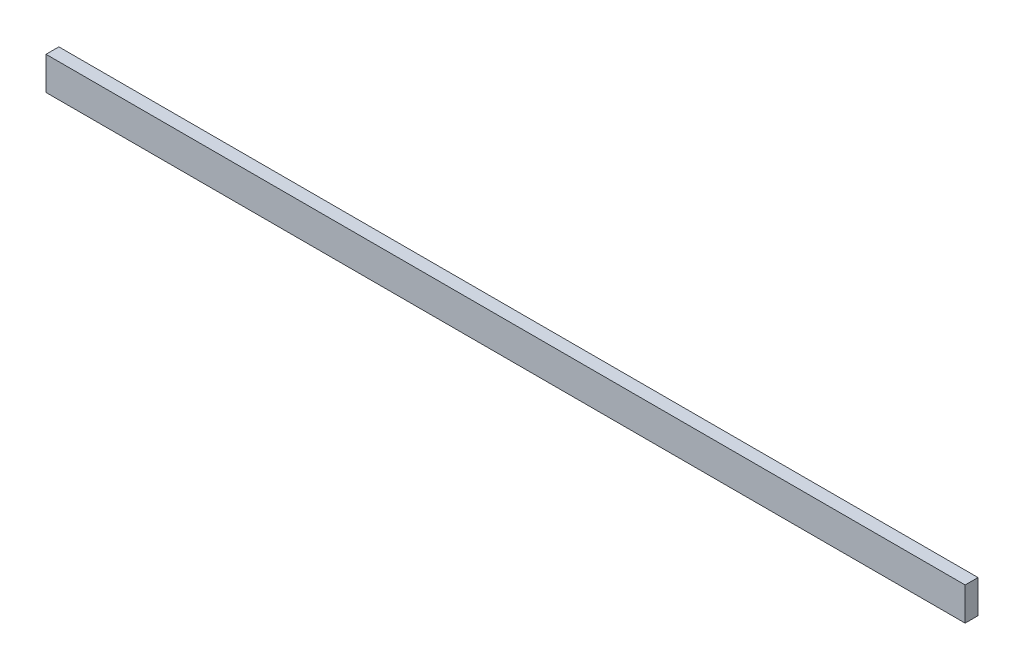
ISO-10303-21;
HEADER;
FILE_DESCRIPTION(('STEP AP214'),'2;1');
FILE_NAME('part.step','',(''),(''),'','','');
FILE_SCHEMA(('AUTOMOTIVE_DESIGN { 1 0 10303 214 1 1 1 1 }'));
ENDSEC;
DATA;
#1=APPLICATION_CONTEXT('core data for automotive mechanical design processes');
#2=APPLICATION_PROTOCOL_DEFINITION('international standard','automotive_design',2000,#1);
#3=PRODUCT_CONTEXT('',#1,'mechanical');
#4=PRODUCT('Part','Part','',(#3));
#5=PRODUCT_RELATED_PRODUCT_CATEGORY('part','',(#4));
#6=PRODUCT_DEFINITION_FORMATION('','',#4);
#7=PRODUCT_DEFINITION_CONTEXT('part definition',#1,'design');
#8=PRODUCT_DEFINITION('design','',#6,#7);
#9=PRODUCT_DEFINITION_SHAPE('','',#8);
#10=(LENGTH_UNIT() NAMED_UNIT(*) SI_UNIT(.MILLI.,.METRE.));
#11=(NAMED_UNIT(*) PLANE_ANGLE_UNIT() SI_UNIT($,.RADIAN.));
#12=(NAMED_UNIT(*) SI_UNIT($,.STERADIAN.) SOLID_ANGLE_UNIT());
#13=UNCERTAINTY_MEASURE_WITH_UNIT(LENGTH_MEASURE(1.E-05),#10,'distance_accuracy_value','');
#14=(GEOMETRIC_REPRESENTATION_CONTEXT(3) GLOBAL_UNCERTAINTY_ASSIGNED_CONTEXT((#13)) GLOBAL_UNIT_ASSIGNED_CONTEXT((#10,
#11,#12)) REPRESENTATION_CONTEXT('',''));
#15=CARTESIAN_POINT('',(0.,0.,0.));
#16=DIRECTION('',(0.,0.,1.));
#17=DIRECTION('',(1.,0.,0.));
#18=AXIS2_PLACEMENT_3D('',#15,#16,#17);
#19=CARTESIAN_POINT('',(-38.9216106508221,24.4845219883618,8.89));
#20=DIRECTION('',(1.,0.,0.));
#21=DIRECTION('',(0.,1.,0.));
#22=AXIS2_PLACEMENT_3D('',#19,#20,#21);
#23=PLANE('',#22);
#24=DIRECTION('',(0.,-1.,0.));
#25=VECTOR('',#24,1.);
#26=CARTESIAN_POINT('',(-38.9216106508221,24.4845219883618,0.));
#27=LINE('',#26,#25);
#28=CARTESIAN_POINT('',(-38.9216106508221,24.4845219883618,0.));
#29=VERTEX_POINT('',#28);
#30=CARTESIAN_POINT('',(-38.9216106508221,1.62452198836178,0.));
#31=VERTEX_POINT('',#30);
#32=EDGE_CURVE('E111',#29,#31,#27,.T.);
#33=ORIENTED_EDGE('',*,*,#32,.T.);
#34=DIRECTION('',(0.,0.,-1.));
#35=VECTOR('',#34,1.);
#36=CARTESIAN_POINT('',(-38.9216106508221,1.62452198836178,8.89));
#37=LINE('',#36,#35);
#38=CARTESIAN_POINT('',(-38.9216106508221,1.62452198836178,8.89));
#39=VERTEX_POINT('',#38);
#40=EDGE_CURVE('E11',#39,#31,#37,.T.);
#41=ORIENTED_EDGE('',*,*,#40,.F.);
#42=DIRECTION('',(0.,-1.,0.));
#43=VECTOR('',#42,1.);
#44=CARTESIAN_POINT('',(-38.9216106508221,24.4845219883618,8.89));
#45=LINE('',#44,#43);
#46=CARTESIAN_POINT('',(-38.9216106508221,24.4845219883618,8.89));
#47=VERTEX_POINT('',#46);
#48=EDGE_CURVE('E95',#47,#39,#45,.T.);
#49=ORIENTED_EDGE('',*,*,#48,.F.);
#50=DIRECTION('',(0.,0.,-1.));
#51=VECTOR('',#50,1.);
#52=CARTESIAN_POINT('',(-38.9216106508221,24.4845219883618,8.89));
#53=LINE('',#52,#51);
#54=EDGE_CURVE('E107',#47,#29,#53,.T.);
#55=ORIENTED_EDGE('',*,*,#54,.T.);
#56=EDGE_LOOP('',(#33,#41,#49,#55));
#57=FACE_BOUND('',#56,.T.);
#58=ADVANCED_FACE('F43',(#57),#23,.F.);
#59=CARTESIAN_POINT('',(-38.9216106508221,1.62452198836178,8.89));
#60=DIRECTION('',(0.,1.,0.));
#61=DIRECTION('',(0.,0.,1.));
#62=AXIS2_PLACEMENT_3D('',#59,#60,#61);
#63=PLANE('',#62);
#64=DIRECTION('',(1.,0.,0.));
#65=VECTOR('',#64,1.);
#66=CARTESIAN_POINT('',(-38.9216106508221,1.62452198836178,0.));
#67=LINE('',#66,#65);
#68=CARTESIAN_POINT('',(596.078389349178,1.62452198836178,0.));
#69=VERTEX_POINT('',#68);
#70=EDGE_CURVE('E100',#31,#69,#67,.T.);
#71=ORIENTED_EDGE('',*,*,#70,.T.);
#72=DIRECTION('',(0.,0.,-1.));
#73=VECTOR('',#72,1.);
#74=CARTESIAN_POINT('',(596.078389349178,1.62452198836178,8.89));
#75=LINE('',#74,#73);
#76=CARTESIAN_POINT('',(596.078389349178,1.62452198836178,8.89));
#77=VERTEX_POINT('',#76);
#78=EDGE_CURVE('E52',#77,#69,#75,.T.);
#79=ORIENTED_EDGE('',*,*,#78,.F.);
#80=DIRECTION('',(1.,0.,0.));
#81=VECTOR('',#80,1.);
#82=CARTESIAN_POINT('',(-38.9216106508221,1.62452198836178,8.89));
#83=LINE('',#82,#81);
#84=EDGE_CURVE('E90',#39,#77,#83,.T.);
#85=ORIENTED_EDGE('',*,*,#84,.F.);
#86=ORIENTED_EDGE('',*,*,#40,.T.);
#87=EDGE_LOOP('',(#71,#79,#85,#86));
#88=FACE_BOUND('',#87,.T.);
#89=ADVANCED_FACE('F99',(#88),#63,.F.);
#90=CARTESIAN_POINT('',(596.078389349178,24.4845219883618,8.89));
#91=DIRECTION('',(-1.,0.,0.));
#92=DIRECTION('',(0.,0.,1.));
#93=AXIS2_PLACEMENT_3D('',#90,#91,#92);
#94=PLANE('',#93);
#95=DIRECTION('',(0.,1.,0.));
#96=VECTOR('',#95,1.);
#97=CARTESIAN_POINT('',(596.078389349178,24.4845219883618,0.));
#98=LINE('',#97,#96);
#99=CARTESIAN_POINT('',(596.078389349178,24.4845219883618,0.));
#100=VERTEX_POINT('',#99);
#101=EDGE_CURVE('E77',#69,#100,#98,.T.);
#102=ORIENTED_EDGE('',*,*,#101,.T.);
#103=DIRECTION('',(0.,0.,-1.));
#104=VECTOR('',#103,1.);
#105=CARTESIAN_POINT('',(596.078389349178,24.4845219883618,8.89));
#106=LINE('',#105,#104);
#107=CARTESIAN_POINT('',(596.078389349178,24.4845219883618,8.89));
#108=VERTEX_POINT('',#107);
#109=EDGE_CURVE('E102',#108,#100,#106,.T.);
#110=ORIENTED_EDGE('',*,*,#109,.F.);
#111=DIRECTION('',(0.,1.,0.));
#112=VECTOR('',#111,1.);
#113=CARTESIAN_POINT('',(596.078389349178,24.4845219883618,8.89));
#114=LINE('',#113,#112);
#115=EDGE_CURVE('E93',#77,#108,#114,.T.);
#116=ORIENTED_EDGE('',*,*,#115,.F.);
#117=ORIENTED_EDGE('',*,*,#78,.T.);
#118=EDGE_LOOP('',(#102,#110,#116,#117));
#119=FACE_BOUND('',#118,.T.);
#120=ADVANCED_FACE('F103',(#119),#94,.F.);
#121=CARTESIAN_POINT('',(-38.9216106508221,24.4845219883618,8.89));
#122=DIRECTION('',(0.,-1.,0.));
#123=DIRECTION('',(0.,0.,-1.));
#124=AXIS2_PLACEMENT_3D('',#121,#122,#123);
#125=PLANE('',#124);
#126=DIRECTION('',(-1.,0.,0.));
#127=VECTOR('',#126,1.);
#128=CARTESIAN_POINT('',(-38.9216106508221,24.4845219883618,0.));
#129=LINE('',#128,#127);
#130=EDGE_CURVE('E83',#100,#29,#129,.T.);
#131=ORIENTED_EDGE('',*,*,#130,.T.);
#132=ORIENTED_EDGE('',*,*,#54,.F.);
#133=DIRECTION('',(-1.,0.,0.));
#134=VECTOR('',#133,1.);
#135=CARTESIAN_POINT('',(-38.9216106508221,24.4845219883618,8.89));
#136=LINE('',#135,#134);
#137=EDGE_CURVE('E60',#108,#47,#136,.T.);
#138=ORIENTED_EDGE('',*,*,#137,.F.);
#139=ORIENTED_EDGE('',*,*,#109,.T.);
#140=EDGE_LOOP('',(#131,#132,#138,#139));
#141=FACE_BOUND('',#140,.T.);
#142=ADVANCED_FACE('F124',(#141),#125,.F.);
#143=CARTESIAN_POINT('',(0.,0.,8.89));
#144=DIRECTION('',(0.,0.,1.));
#145=DIRECTION('',(1.,0.,0.));
#146=AXIS2_PLACEMENT_3D('',#143,#144,#145);
#147=PLANE('',#146);
#148=ORIENTED_EDGE('',*,*,#48,.T.);
#149=ORIENTED_EDGE('',*,*,#84,.T.);
#150=ORIENTED_EDGE('',*,*,#115,.T.);
#151=ORIENTED_EDGE('',*,*,#137,.T.);
#152=EDGE_LOOP('',(#148,#149,#150,#151));
#153=FACE_BOUND('',#152,.T.);
#154=ADVANCED_FACE('F91',(#153),#147,.T.);
#155=CARTESIAN_POINT('',(0.,0.,0.));
#156=DIRECTION('',(0.,0.,1.));
#157=DIRECTION('',(1.,0.,0.));
#158=AXIS2_PLACEMENT_3D('',#155,#156,#157);
#159=PLANE('',#158);
#160=ORIENTED_EDGE('',*,*,#32,.F.);
#161=ORIENTED_EDGE('',*,*,#130,.F.);
#162=ORIENTED_EDGE('',*,*,#101,.F.);
#163=ORIENTED_EDGE('',*,*,#70,.F.);
#164=EDGE_LOOP('',(#160,#161,#162,#163));
#165=FACE_BOUND('',#164,.T.);
#166=ADVANCED_FACE('F127',(#165),#159,.F.);
#167=CLOSED_SHELL('',(#58,#89,#120,#142,#154,#166));
#168=MANIFOLD_SOLID_BREP('B2',#167);
#169=ADVANCED_BREP_SHAPE_REPRESENTATION('',(#18,#168),#14);
#170=SHAPE_DEFINITION_REPRESENTATION(#9,#169);
ENDSEC;
END-ISO-10303-21;
